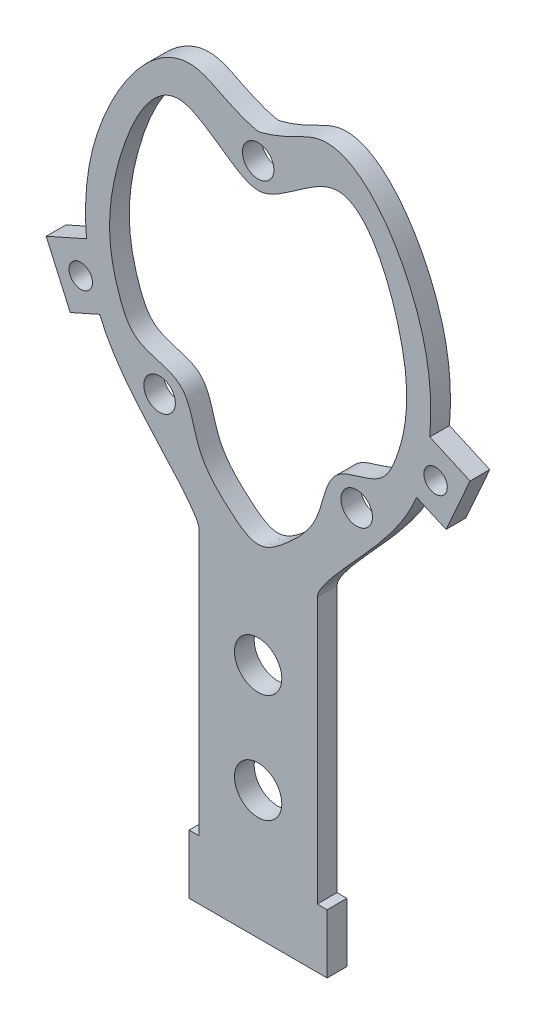
ISO-10303-21;
HEADER;
FILE_DESCRIPTION(('STEP AP214'),'2;1');
FILE_NAME('part.step','',(''),(''),'','','');
FILE_SCHEMA(('AUTOMOTIVE_DESIGN { 1 0 10303 214 1 1 1 1 }'));
ENDSEC;
DATA;
#1=APPLICATION_CONTEXT('core data for automotive mechanical design processes');
#2=APPLICATION_PROTOCOL_DEFINITION('international standard','automotive_design',2000,#1);
#3=PRODUCT_CONTEXT('',#1,'mechanical');
#4=PRODUCT('Part','Part','',(#3));
#5=PRODUCT_RELATED_PRODUCT_CATEGORY('part','',(#4));
#6=PRODUCT_DEFINITION_FORMATION('','',#4);
#7=PRODUCT_DEFINITION_CONTEXT('part definition',#1,'design');
#8=PRODUCT_DEFINITION('design','',#6,#7);
#9=PRODUCT_DEFINITION_SHAPE('','',#8);
#10=(LENGTH_UNIT() NAMED_UNIT(*) SI_UNIT(.MILLI.,.METRE.));
#11=(NAMED_UNIT(*) PLANE_ANGLE_UNIT() SI_UNIT($,.RADIAN.));
#12=(NAMED_UNIT(*) SI_UNIT($,.STERADIAN.) SOLID_ANGLE_UNIT());
#13=UNCERTAINTY_MEASURE_WITH_UNIT(LENGTH_MEASURE(1.E-05),#10,'distance_accuracy_value','');
#14=(GEOMETRIC_REPRESENTATION_CONTEXT(3) GLOBAL_UNCERTAINTY_ASSIGNED_CONTEXT((#13)) GLOBAL_UNIT_ASSIGNED_CONTEXT((#10,
#11,#12)) REPRESENTATION_CONTEXT('',''));
#15=CARTESIAN_POINT('',(0.,0.,0.));
#16=DIRECTION('',(0.,0.,1.));
#17=DIRECTION('',(1.,0.,0.));
#18=AXIS2_PLACEMENT_3D('',#15,#16,#17);
#19=CARTESIAN_POINT('',(3.,-12.1,1.));
#20=CARTESIAN_POINT('',(3.05810382849844,-11.4358702012722,1.));
#21=CARTESIAN_POINT('',(7.37215641866731,-7.261735624356,1.));
#22=CARTESIAN_POINT('',(8.81630154843034,-3.81963664134236,1.));
#23=CARTESIAN_POINT('',(8.79521131462366,3.08822074814355,1.));
#24=CARTESIAN_POINT('',(4.729906030544,9.50271441729499,1.));
#25=CARTESIAN_POINT('',(1.543138013164,7.28524745478808,1.));
#26=CARTESIAN_POINT('',(0.138381746873035,6.84873014882035,1.));
#27=CARTESIAN_POINT('',(-0.138381746873038,6.84873014882035,1.));
#28=CARTESIAN_POINT('',(-1.54313801316398,7.28524745478808,1.));
#29=CARTESIAN_POINT('',(-4.72990603054404,9.50271441729499,1.));
#30=CARTESIAN_POINT('',(-8.79521131462372,3.0882207481436,1.));
#31=CARTESIAN_POINT('',(-8.8163015484302,-3.81963664134249,1.));
#32=CARTESIAN_POINT('',(-7.37215641866838,-7.26173562435472,1.));
#33=CARTESIAN_POINT('',(-3.05810382849843,-11.4358702012722,1.));
#34=CARTESIAN_POINT('',(-3.,-12.1,1.));
#35=B_SPLINE_CURVE_WITH_KNOTS('',3,(#19,#20,#21,#22,#23,#24,#25,#26,#27,#28,#29,#30,#31,#32,#33,
#34),.UNSPECIFIED.,.F.,.F.,(4,1,1,1,1,1,1,1,1,1,1,1,1,4),(0.110531839016768,0.195870509209985,
0.310871914861414,0.375079995003274,0.502014152037678,0.537662277859493,0.553505555343509,
0.55702628367329,0.572869561157307,0.608517686979122,0.735451844013526,0.799659924155386,
0.914661329806814,1.),.UNSPECIFIED.);
#36=DIRECTION('',(0.,0.,-1.));
#37=VECTOR('',#36,1.);
#38=SURFACE_OF_LINEAR_EXTRUSION('',#35,#37);
#39=DIRECTION('',(0.,0.,-1.));
#40=VECTOR('',#39,1.);
#41=CARTESIAN_POINT('',(8.03882350949442,-5.2140110725418,1.));
#42=LINE('',#41,#40);
#43=CARTESIAN_POINT('',(8.03882351508527,-5.2140110590012,1.));
#44=VERTEX_POINT('',#43);
#45=CARTESIAN_POINT('',(8.03882351508527,-5.2140110590012,0.));
#46=VERTEX_POINT('',#45);
#47=EDGE_CURVE('E60',#44,#46,#42,.T.);
#48=ORIENTED_EDGE('',*,*,#47,.F.);
#49=CARTESIAN_POINT('',(3.,-12.1,1.));
#50=VERTEX_POINT('',#49);
#51=EDGE_CURVE('E159',#50,#44,#35,.T.);
#52=ORIENTED_EDGE('',*,*,#51,.F.);
#53=DIRECTION('',(0.,0.,-1.));
#54=VECTOR('',#53,1.);
#55=CARTESIAN_POINT('',(3.,-12.1,1.));
#56=LINE('',#55,#54);
#57=CARTESIAN_POINT('',(3.,-12.1,0.));
#58=VERTEX_POINT('',#57);
#59=EDGE_CURVE('E601',#50,#58,#56,.T.);
#60=ORIENTED_EDGE('',*,*,#59,.T.);
#61=CARTESIAN_POINT('',(3.,-12.1,0.));
#62=CARTESIAN_POINT('',(3.05810382849844,-11.4358702012722,0.));
#63=CARTESIAN_POINT('',(7.37215641866731,-7.261735624356,0.));
#64=CARTESIAN_POINT('',(8.81630154843034,-3.81963664134236,0.));
#65=CARTESIAN_POINT('',(8.79521131462366,3.08822074814355,0.));
#66=CARTESIAN_POINT('',(4.729906030544,9.50271441729499,0.));
#67=CARTESIAN_POINT('',(1.543138013164,7.28524745478808,0.));
#68=CARTESIAN_POINT('',(0.138381746873035,6.84873014882035,0.));
#69=CARTESIAN_POINT('',(-0.138381746873038,6.84873014882035,0.));
#70=CARTESIAN_POINT('',(-1.54313801316398,7.28524745478808,0.));
#71=CARTESIAN_POINT('',(-4.72990603054404,9.50271441729499,0.));
#72=CARTESIAN_POINT('',(-8.79521131462372,3.0882207481436,0.));
#73=CARTESIAN_POINT('',(-8.8163015484302,-3.81963664134249,0.));
#74=CARTESIAN_POINT('',(-7.37215641866838,-7.26173562435472,0.));
#75=CARTESIAN_POINT('',(-3.05810382849843,-11.4358702012722,0.));
#76=CARTESIAN_POINT('',(-3.,-12.1,0.));
#77=B_SPLINE_CURVE_WITH_KNOTS('',3,(#61,#62,#63,#64,#65,#66,#67,#68,#69,#70,#71,#72,#73,#74,#75,
#76),.UNSPECIFIED.,.F.,.F.,(4,1,1,1,1,1,1,1,1,1,1,1,1,4),(0.110531839016768,0.195870509209985,
0.310871914861414,0.375079995003274,0.502014152037678,0.537662277859493,0.553505555343509,
0.55702628367329,0.572869561157307,0.608517686979122,0.735451844013526,0.799659924155386,
0.914661329806814,1.),.UNSPECIFIED.);
#78=EDGE_CURVE('E602',#58,#46,#77,.T.);
#79=ORIENTED_EDGE('',*,*,#78,.T.);
#80=EDGE_LOOP('',(#48,#52,#60,#79));
#81=FACE_BOUND('',#80,.T.);
#82=ADVANCED_FACE('F36',(#81),#38,.F.);
#83=CARTESIAN_POINT('',(8.70653859742456,-2.22738816520244,1.));
#84=VERTEX_POINT('',#83);
#85=CARTESIAN_POINT('',(-8.70653859742455,-2.22738816520243,1.));
#86=VERTEX_POINT('',#85);
#87=EDGE_CURVE('E52',#84,#86,#35,.T.);
#88=ORIENTED_EDGE('',*,*,#87,.F.);
#89=DIRECTION('',(0.,0.,-1.));
#90=VECTOR('',#89,1.);
#91=CARTESIAN_POINT('',(8.70653859884648,-2.22738814841654,1.));
#92=LINE('',#91,#90);
#93=CARTESIAN_POINT('',(8.70653860389698,-2.22738815066517,0.));
#94=VERTEX_POINT('',#93);
#95=EDGE_CURVE('E187',#84,#94,#92,.T.);
#96=ORIENTED_EDGE('',*,*,#95,.T.);
#97=CARTESIAN_POINT('',(-8.70653859742455,-2.22738816520243,0.));
#98=VERTEX_POINT('',#97);
#99=EDGE_CURVE('E566',#94,#98,#77,.T.);
#100=ORIENTED_EDGE('',*,*,#99,.T.);
#101=DIRECTION('',(0.,0.,-1.));
#102=VECTOR('',#101,1.);
#103=CARTESIAN_POINT('',(-8.70653859884646,-2.22738814841654,1.));
#104=LINE('',#103,#102);
#105=EDGE_CURVE('E45',#86,#98,#104,.T.);
#106=ORIENTED_EDGE('',*,*,#105,.F.);
#107=EDGE_LOOP('',(#88,#96,#100,#106));
#108=FACE_BOUND('',#107,.T.);
#109=ADVANCED_FACE('F264',(#108),#38,.F.);
#110=CARTESIAN_POINT('',(4.53553956002682E-13,6.85,1.));
#111=DIRECTION('',(0.,0.,1.));
#112=DIRECTION('',(1.,0.,0.));
#113=AXIS2_PLACEMENT_3D('',#110,#111,#112);
#114=PLANE('',#113);
#115=CARTESIAN_POINT('',(-8.99999999638667,-4.00000000811566,0.999999999999999));
#116=DIRECTION('',(0.,0.,1.));
#117=DIRECTION('',(1.,0.,0.));
#118=AXIS2_PLACEMENT_3D('',#115,#116,#117);
#119=CIRCLE('',#118,0.59499999891735);
#120=CARTESIAN_POINT('',(-8.40499999746932,-4.00000000811566,0.999999999999999));
#121=VERTEX_POINT('',#120);
#122=EDGE_CURVE('E182',#121,#121,#119,.F.);
#123=ORIENTED_EDGE('',*,*,#122,.T.);
#124=EDGE_LOOP('',(#123));
#125=FACE_BOUND('',#124,.T.);
#126=CARTESIAN_POINT('',(8.99999999638667,-4.00000000811566,0.999999999999999));
#127=DIRECTION('',(0.,0.,1.));
#128=DIRECTION('',(1.,0.,0.));
#129=AXIS2_PLACEMENT_3D('',#126,#127,#128);
#130=CIRCLE('',#129,0.594999998917349);
#131=CARTESIAN_POINT('',(9.59499999530402,-4.00000000811566,0.999999999999999));
#132=VERTEX_POINT('',#131);
#133=EDGE_CURVE('E553',#132,#132,#130,.F.);
#134=ORIENTED_EDGE('',*,*,#133,.T.);
#135=EDGE_LOOP('',(#134));
#136=FACE_BOUND('',#135,.T.);
#137=ORIENTED_EDGE('',*,*,#51,.T.);
#138=DIRECTION('',(0.9135454576426,-0.406736643075802,0.));
#139=VECTOR('',#138,1.);
#140=CARTESIAN_POINT('',(-0.607482344183345,-1.36442768453332,1.));
#141=LINE('',#140,#139);
#142=CARTESIAN_POINT('',(9.53182685743955,-5.87873899030865,1.));
#143=VERTEX_POINT('',#142);
#144=EDGE_CURVE('E152',#44,#143,#141,.T.);
#145=ORIENTED_EDGE('',*,*,#144,.T.);
#146=DIRECTION('',(-0.406736643075801,-0.913545457642601,0.));
#147=VECTOR('',#146,1.);
#148=CARTESIAN_POINT('',(10.1393092016229,-4.51431130577532,1.));
#149=LINE('',#148,#147);
#150=CARTESIAN_POINT('',(10.752036786667,-3.13810261738085,1.));
#151=VERTEX_POINT('',#150);
#152=EDGE_CURVE('E158',#151,#143,#149,.T.);
#153=ORIENTED_EDGE('',*,*,#152,.F.);
#154=DIRECTION('',(0.913545457642601,-0.406736643075801,0.));
#155=VECTOR('',#154,1.);
#156=CARTESIAN_POINT('',(0.612727585044053,1.37620868839447,1.));
#157=LINE('',#156,#155);
#158=EDGE_CURVE('E161',#84,#151,#157,.T.);
#159=ORIENTED_EDGE('',*,*,#158,.F.);
#160=ORIENTED_EDGE('',*,*,#87,.T.);
#161=DIRECTION('',(-0.913545457642601,-0.406736643075801,0.));
#162=VECTOR('',#161,1.);
#163=CARTESIAN_POINT('',(-0.612727585044054,1.37620868839447,1.));
#164=LINE('',#163,#162);
#165=CARTESIAN_POINT('',(-10.752036786667,-3.13810261738085,1.));
#166=VERTEX_POINT('',#165);
#167=EDGE_CURVE('E192',#86,#166,#164,.T.);
#168=ORIENTED_EDGE('',*,*,#167,.T.);
#169=DIRECTION('',(0.406736643075801,-0.913545457642601,0.));
#170=VECTOR('',#169,1.);
#171=CARTESIAN_POINT('',(-10.1393092016229,-4.51431130577532,1.));
#172=LINE('',#171,#170);
#173=CARTESIAN_POINT('',(-9.53182685743955,-5.87873899030865,1.));
#174=VERTEX_POINT('',#173);
#175=EDGE_CURVE('E195',#166,#174,#172,.T.);
#176=ORIENTED_EDGE('',*,*,#175,.T.);
#177=DIRECTION('',(-0.9135454576426,-0.406736643075802,0.));
#178=VECTOR('',#177,1.);
#179=CARTESIAN_POINT('',(0.607482344183347,-1.36442768453333,1.));
#180=LINE('',#179,#178);
#181=CARTESIAN_POINT('',(-8.03882351508523,-5.21401105900164,1.));
#182=VERTEX_POINT('',#181);
#183=EDGE_CURVE('E190',#182,#174,#180,.T.);
#184=ORIENTED_EDGE('',*,*,#183,.F.);
#185=CARTESIAN_POINT('',(-3.,-12.1,1.));
#186=VERTEX_POINT('',#185);
#187=EDGE_CURVE('E564',#182,#186,#35,.T.);
#188=ORIENTED_EDGE('',*,*,#187,.T.);
#189=DIRECTION('',(0.,-1.,0.));
#190=VECTOR('',#189,1.);
#191=CARTESIAN_POINT('',(-3.,-12.1,1.));
#192=LINE('',#191,#190);
#193=CARTESIAN_POINT('',(-3.,-25.6,1.));
#194=VERTEX_POINT('',#193);
#195=EDGE_CURVE('E586',#186,#194,#192,.T.);
#196=ORIENTED_EDGE('',*,*,#195,.T.);
#197=DIRECTION('',(-1.,0.,0.));
#198=VECTOR('',#197,1.);
#199=CARTESIAN_POINT('',(-3.,-25.6,1.));
#200=LINE('',#199,#198);
#201=CARTESIAN_POINT('',(-3.50000000000003,-25.6,1.));
#202=VERTEX_POINT('',#201);
#203=EDGE_CURVE('E587',#194,#202,#200,.T.);
#204=ORIENTED_EDGE('',*,*,#203,.T.);
#205=DIRECTION('',(0.,-1.,0.));
#206=VECTOR('',#205,1.);
#207=CARTESIAN_POINT('',(-3.50000000000003,-25.6,1.));
#208=LINE('',#207,#206);
#209=CARTESIAN_POINT('',(-3.49999999999999,-28.6,1.));
#210=VERTEX_POINT('',#209);
#211=EDGE_CURVE('E589',#202,#210,#208,.T.);
#212=ORIENTED_EDGE('',*,*,#211,.T.);
#213=DIRECTION('',(1.,0.,0.));
#214=VECTOR('',#213,1.);
#215=CARTESIAN_POINT('',(-3.49999999999999,-28.6,1.));
#216=LINE('',#215,#214);
#217=CARTESIAN_POINT('',(3.50000000000001,-28.6,1.));
#218=VERTEX_POINT('',#217);
#219=EDGE_CURVE('E593',#210,#218,#216,.T.);
#220=ORIENTED_EDGE('',*,*,#219,.T.);
#221=DIRECTION('',(0.,1.,0.));
#222=VECTOR('',#221,1.);
#223=CARTESIAN_POINT('',(3.50000000000001,-25.6,1.));
#224=LINE('',#223,#222);
#225=CARTESIAN_POINT('',(3.50000000000001,-25.6,1.));
#226=VERTEX_POINT('',#225);
#227=EDGE_CURVE('E595',#218,#226,#224,.T.);
#228=ORIENTED_EDGE('',*,*,#227,.T.);
#229=DIRECTION('',(-1.,0.,0.));
#230=VECTOR('',#229,1.);
#231=CARTESIAN_POINT('',(3.50000000000001,-25.6,1.));
#232=LINE('',#231,#230);
#233=CARTESIAN_POINT('',(3.,-25.6,1.));
#234=VERTEX_POINT('',#233);
#235=EDGE_CURVE('E597',#226,#234,#232,.T.);
#236=ORIENTED_EDGE('',*,*,#235,.T.);
#237=DIRECTION('',(0.,1.,0.));
#238=VECTOR('',#237,1.);
#239=CARTESIAN_POINT('',(3.,-12.1,1.));
#240=LINE('',#239,#238);
#241=EDGE_CURVE('E599',#234,#50,#240,.T.);
#242=ORIENTED_EDGE('',*,*,#241,.T.);
#243=EDGE_LOOP('',(#137,#145,#153,#159,#160,#168,#176,#184,#188,#196,#204,#212,#220,#228,#236,#242));
#244=FACE_BOUND('',#243,.T.);
#245=CARTESIAN_POINT('',(0.,-16.6,1.));
#246=DIRECTION('',(0.,0.,1.));
#247=DIRECTION('',(1.,0.,0.));
#248=AXIS2_PLACEMENT_3D('',#245,#246,#247);
#249=CIRCLE('',#248,1.2);
#250=CARTESIAN_POINT('',(1.2,-16.6,1.));
#251=VERTEX_POINT('',#250);
#252=EDGE_CURVE('E216',#251,#251,#249,.T.);
#253=ORIENTED_EDGE('',*,*,#252,.F.);
#254=EDGE_LOOP('',(#253));
#255=FACE_BOUND('',#254,.T.);
#256=CARTESIAN_POINT('',(-5.,-7.2,1.));
#257=DIRECTION('',(0.,0.,1.));
#258=DIRECTION('',(1.,0.,0.));
#259=AXIS2_PLACEMENT_3D('',#256,#257,#258);
#260=CIRCLE('',#259,0.8);
#261=CARTESIAN_POINT('',(-4.2,-7.2,1.));
#262=VERTEX_POINT('',#261);
#263=EDGE_CURVE('E228',#262,#262,#260,.T.);
#264=ORIENTED_EDGE('',*,*,#263,.F.);
#265=EDGE_LOOP('',(#264));
#266=FACE_BOUND('',#265,.T.);
#267=CARTESIAN_POINT('',(0.,4.25,1.));
#268=CARTESIAN_POINT('',(-0.417612959241417,4.25,1.));
#269=CARTESIAN_POINT('',(-1.80690934296593,5.01629001903986,1.));
#270=CARTESIAN_POINT('',(-4.90120456094953,7.75406004665749,1.));
#271=CARTESIAN_POINT('',(-7.77102892828171,1.12814854184186,1.));
#272=CARTESIAN_POINT('',(-7.63128250838788,-2.66139211837862,1.));
#273=CARTESIAN_POINT('',(-6.25678998999508,-5.75795043264524,1.));
#274=CARTESIAN_POINT('',(-3.50148126295744,-5.76089978012249,1.));
#275=CARTESIAN_POINT('',(-3.23010948222929,-8.78442848255788,1.));
#276=CARTESIAN_POINT('',(-1.74530404014567,-10.3140203641093,1.));
#277=CARTESIAN_POINT('',(0.,-11.6773888370486,1.));
#278=CARTESIAN_POINT('',(1.74530404014568,-10.3140203641093,1.));
#279=CARTESIAN_POINT('',(3.23010948222929,-8.78442848255788,1.));
#280=CARTESIAN_POINT('',(3.50148126295744,-5.76089978012249,1.));
#281=CARTESIAN_POINT('',(6.25678998999508,-5.75795043264524,1.));
#282=CARTESIAN_POINT('',(7.63128250838789,-2.66139211837861,1.));
#283=CARTESIAN_POINT('',(7.77102892828171,1.12814854184186,1.));
#284=CARTESIAN_POINT('',(4.90120456094953,7.75406004665749,1.));
#285=CARTESIAN_POINT('',(1.80690934296593,5.01629001903987,1.));
#286=CARTESIAN_POINT('',(0.417612959241416,4.25,1.));
#287=CARTESIAN_POINT('',(0.,4.25,1.));
#288=B_SPLINE_CURVE_WITH_KNOTS('',3,(#267,#268,#269,#270,#271,#272,#273,#274,#275,#276,#277,
#278,#279,#280,#281,#282,#283,#284,#285,#286,#287),.UNSPECIFIED.,.T.,.F.,(4,1,1,1,1,1,1,1,1,1,1,
1,1,1,1,1,1,1,4),(0.,0.0256073609969135,0.0851894397491001,0.194127412314609,0.29881024186166,
0.326537395156787,0.373370364280356,0.421073962555122,0.469790648406979,0.5,0.530209351593021,
0.578926037444877,0.626629635719644,0.673462604843213,0.70118975813834,0.805872587685391,
0.9148105602509,0.974392639003086,1.),.UNSPECIFIED.);
#289=CARTESIAN_POINT('',(0.,4.25,1.));
#290=VERTEX_POINT('',#289);
#291=EDGE_CURVE('E240',#290,#290,#288,.T.);
#292=ORIENTED_EDGE('',*,*,#291,.F.);
#293=EDGE_LOOP('',(#292));
#294=FACE_BOUND('',#293,.T.);
#295=CARTESIAN_POINT('',(0.,5.55,1.));
#296=DIRECTION('',(0.,0.,1.));
#297=DIRECTION('',(1.,0.,0.));
#298=AXIS2_PLACEMENT_3D('',#295,#296,#297);
#299=CIRCLE('',#298,0.8);
#300=CARTESIAN_POINT('',(0.8,5.55,1.));
#301=VERTEX_POINT('',#300);
#302=EDGE_CURVE('E234',#301,#301,#299,.T.);
#303=ORIENTED_EDGE('',*,*,#302,.F.);
#304=EDGE_LOOP('',(#303));
#305=FACE_BOUND('',#304,.T.);
#306=CARTESIAN_POINT('',(5.,-7.2,1.));
#307=DIRECTION('',(0.,0.,1.));
#308=DIRECTION('',(-1.,0.,0.));
#309=AXIS2_PLACEMENT_3D('',#306,#307,#308);
#310=CIRCLE('',#309,0.8);
#311=CARTESIAN_POINT('',(4.2,-7.2,1.));
#312=VERTEX_POINT('',#311);
#313=EDGE_CURVE('E222',#312,#312,#310,.T.);
#314=ORIENTED_EDGE('',*,*,#313,.F.);
#315=EDGE_LOOP('',(#314));
#316=FACE_BOUND('',#315,.T.);
#317=CARTESIAN_POINT('',(0.,-22.1,1.));
#318=DIRECTION('',(0.,0.,1.));
#319=DIRECTION('',(1.,0.,0.));
#320=AXIS2_PLACEMENT_3D('',#317,#318,#319);
#321=CIRCLE('',#320,1.2);
#322=CARTESIAN_POINT('',(1.2,-22.1,1.));
#323=VERTEX_POINT('',#322);
#324=EDGE_CURVE('E210',#323,#323,#321,.T.);
#325=ORIENTED_EDGE('',*,*,#324,.F.);
#326=EDGE_LOOP('',(#325));
#327=FACE_BOUND('',#326,.T.);
#328=ADVANCED_FACE('F154',(#125,#136,#244,#255,#266,#294,#305,#316,#327),#114,.T.);
#329=CARTESIAN_POINT('',(4.53553956002682E-13,6.85,0.));
#330=DIRECTION('',(0.,0.,1.));
#331=DIRECTION('',(1.,0.,0.));
#332=AXIS2_PLACEMENT_3D('',#329,#330,#331);
#333=PLANE('',#332);
#334=CARTESIAN_POINT('',(-8.99999999638667,-4.00000000811566,0.));
#335=DIRECTION('',(0.,0.,1.));
#336=DIRECTION('',(1.,0.,0.));
#337=AXIS2_PLACEMENT_3D('',#334,#335,#336);
#338=CIRCLE('',#337,0.59499999891735);
#339=CARTESIAN_POINT('',(-8.40499999746932,-4.00000000811566,0.));
#340=VERTEX_POINT('',#339);
#341=EDGE_CURVE('E552',#340,#340,#338,.T.);
#342=ORIENTED_EDGE('',*,*,#341,.T.);
#343=EDGE_LOOP('',(#342));
#344=FACE_BOUND('',#343,.T.);
#345=CARTESIAN_POINT('',(8.99999999638667,-4.00000000811566,0.));
#346=DIRECTION('',(0.,0.,1.));
#347=DIRECTION('',(-1.,0.,0.));
#348=AXIS2_PLACEMENT_3D('',#345,#346,#347);
#349=CIRCLE('',#348,0.594999998917349);
#350=CARTESIAN_POINT('',(8.40499999746932,-4.00000000811566,0.));
#351=VERTEX_POINT('',#350);
#352=EDGE_CURVE('E554',#351,#351,#349,.T.);
#353=ORIENTED_EDGE('',*,*,#352,.T.);
#354=EDGE_LOOP('',(#353));
#355=FACE_BOUND('',#354,.T.);
#356=ORIENTED_EDGE('',*,*,#99,.F.);
#357=DIRECTION('',(0.913545457642601,-0.406736643075801,0.));
#358=VECTOR('',#357,1.);
#359=CARTESIAN_POINT('',(0.612727585044053,1.37620868839447,0.));
#360=LINE('',#359,#358);
#361=CARTESIAN_POINT('',(10.752036786667,-3.13810261738085,0.));
#362=VERTEX_POINT('',#361);
#363=EDGE_CURVE('E180',#94,#362,#360,.T.);
#364=ORIENTED_EDGE('',*,*,#363,.T.);
#365=DIRECTION('',(-0.406736643075801,-0.913545457642601,0.));
#366=VECTOR('',#365,1.);
#367=CARTESIAN_POINT('',(10.1393092016229,-4.51431130577532,0.));
#368=LINE('',#367,#366);
#369=CARTESIAN_POINT('',(9.53182685743955,-5.87873899030865,0.));
#370=VERTEX_POINT('',#369);
#371=EDGE_CURVE('E184',#362,#370,#368,.T.);
#372=ORIENTED_EDGE('',*,*,#371,.T.);
#373=DIRECTION('',(0.9135454576426,-0.406736643075802,0.));
#374=VECTOR('',#373,1.);
#375=CARTESIAN_POINT('',(-0.607482344183345,-1.36442768453332,0.));
#376=LINE('',#375,#374);
#377=EDGE_CURVE('E167',#46,#370,#376,.T.);
#378=ORIENTED_EDGE('',*,*,#377,.F.);
#379=ORIENTED_EDGE('',*,*,#78,.F.);
#380=DIRECTION('',(0.,1.,0.));
#381=VECTOR('',#380,1.);
#382=CARTESIAN_POINT('',(3.,-12.1,0.));
#383=LINE('',#382,#381);
#384=CARTESIAN_POINT('',(3.,-25.6,0.));
#385=VERTEX_POINT('',#384);
#386=EDGE_CURVE('E579',#385,#58,#383,.T.);
#387=ORIENTED_EDGE('',*,*,#386,.F.);
#388=DIRECTION('',(-1.,0.,0.));
#389=VECTOR('',#388,1.);
#390=CARTESIAN_POINT('',(3.50000000000001,-25.6,0.));
#391=LINE('',#390,#389);
#392=CARTESIAN_POINT('',(3.50000000000001,-25.6,0.));
#393=VERTEX_POINT('',#392);
#394=EDGE_CURVE('E580',#393,#385,#391,.T.);
#395=ORIENTED_EDGE('',*,*,#394,.F.);
#396=DIRECTION('',(0.,1.,0.));
#397=VECTOR('',#396,1.);
#398=CARTESIAN_POINT('',(3.50000000000001,-25.6,0.));
#399=LINE('',#398,#397);
#400=CARTESIAN_POINT('',(3.50000000000001,-28.6,0.));
#401=VERTEX_POINT('',#400);
#402=EDGE_CURVE('E617',#401,#393,#399,.T.);
#403=ORIENTED_EDGE('',*,*,#402,.F.);
#404=DIRECTION('',(1.,0.,0.));
#405=VECTOR('',#404,1.);
#406=CARTESIAN_POINT('',(-3.49999999999999,-28.6,0.));
#407=LINE('',#406,#405);
#408=CARTESIAN_POINT('',(-3.49999999999999,-28.6,0.));
#409=VERTEX_POINT('',#408);
#410=EDGE_CURVE('E615',#409,#401,#407,.T.);
#411=ORIENTED_EDGE('',*,*,#410,.F.);
#412=DIRECTION('',(0.,-1.,0.));
#413=VECTOR('',#412,1.);
#414=CARTESIAN_POINT('',(-3.50000000000003,-25.6,0.));
#415=LINE('',#414,#413);
#416=CARTESIAN_POINT('',(-3.50000000000003,-25.6,0.));
#417=VERTEX_POINT('',#416);
#418=EDGE_CURVE('E613',#417,#409,#415,.T.);
#419=ORIENTED_EDGE('',*,*,#418,.F.);
#420=DIRECTION('',(-1.,0.,0.));
#421=VECTOR('',#420,1.);
#422=CARTESIAN_POINT('',(-3.,-25.6,0.));
#423=LINE('',#422,#421);
#424=CARTESIAN_POINT('',(-3.,-25.6,0.));
#425=VERTEX_POINT('',#424);
#426=EDGE_CURVE('E611',#425,#417,#423,.T.);
#427=ORIENTED_EDGE('',*,*,#426,.F.);
#428=DIRECTION('',(0.,-1.,0.));
#429=VECTOR('',#428,1.);
#430=CARTESIAN_POINT('',(-3.,-12.1,0.));
#431=LINE('',#430,#429);
#432=CARTESIAN_POINT('',(-3.,-12.1,0.));
#433=VERTEX_POINT('',#432);
#434=EDGE_CURVE('E606',#433,#425,#431,.T.);
#435=ORIENTED_EDGE('',*,*,#434,.F.);
#436=CARTESIAN_POINT('',(-8.03882350912916,-5.21401107237918,0.));
#437=VERTEX_POINT('',#436);
#438=EDGE_CURVE('E246',#437,#433,#77,.T.);
#439=ORIENTED_EDGE('',*,*,#438,.F.);
#440=DIRECTION('',(-0.9135454576426,-0.406736643075802,0.));
#441=VECTOR('',#440,1.);
#442=CARTESIAN_POINT('',(0.607482344183347,-1.36442768453333,0.));
#443=LINE('',#442,#441);
#444=CARTESIAN_POINT('',(-9.53182685743955,-5.87873899030865,0.));
#445=VERTEX_POINT('',#444);
#446=EDGE_CURVE('E189',#437,#445,#443,.T.);
#447=ORIENTED_EDGE('',*,*,#446,.T.);
#448=DIRECTION('',(0.406736643075801,-0.913545457642601,0.));
#449=VECTOR('',#448,1.);
#450=CARTESIAN_POINT('',(-10.1393092016229,-4.51431130577532,0.));
#451=LINE('',#450,#449);
#452=CARTESIAN_POINT('',(-10.752036786667,-3.13810261738085,0.));
#453=VERTEX_POINT('',#452);
#454=EDGE_CURVE('E193',#453,#445,#451,.T.);
#455=ORIENTED_EDGE('',*,*,#454,.F.);
#456=DIRECTION('',(-0.913545457642601,-0.406736643075801,0.));
#457=VECTOR('',#456,1.);
#458=CARTESIAN_POINT('',(-0.612727585044054,1.37620868839447,0.));
#459=LINE('',#458,#457);
#460=EDGE_CURVE('E200',#98,#453,#459,.T.);
#461=ORIENTED_EDGE('',*,*,#460,.F.);
#462=EDGE_LOOP('',(#356,#364,#372,#378,#379,#387,#395,#403,#411,#419,#427,#435,#439,#447,#455,#461));
#463=FACE_BOUND('',#462,.T.);
#464=CARTESIAN_POINT('',(0.,4.25,0.));
#465=CARTESIAN_POINT('',(-0.417612959241417,4.25,0.));
#466=CARTESIAN_POINT('',(-1.80690934296593,5.01629001903986,0.));
#467=CARTESIAN_POINT('',(-4.90120456094953,7.75406004665749,0.));
#468=CARTESIAN_POINT('',(-7.77102892828171,1.12814854184186,0.));
#469=CARTESIAN_POINT('',(-7.63128250838788,-2.66139211837862,0.));
#470=CARTESIAN_POINT('',(-6.25678998999508,-5.75795043264524,0.));
#471=CARTESIAN_POINT('',(-3.50148126295744,-5.76089978012249,0.));
#472=CARTESIAN_POINT('',(-3.23010948222929,-8.78442848255788,0.));
#473=CARTESIAN_POINT('',(-1.74530404014567,-10.3140203641093,0.));
#474=CARTESIAN_POINT('',(0.,-11.6773888370486,0.));
#475=CARTESIAN_POINT('',(1.74530404014568,-10.3140203641093,0.));
#476=CARTESIAN_POINT('',(3.23010948222929,-8.78442848255788,0.));
#477=CARTESIAN_POINT('',(3.50148126295744,-5.76089978012249,0.));
#478=CARTESIAN_POINT('',(6.25678998999508,-5.75795043264524,0.));
#479=CARTESIAN_POINT('',(7.63128250838789,-2.66139211837861,0.));
#480=CARTESIAN_POINT('',(7.77102892828171,1.12814854184186,0.));
#481=CARTESIAN_POINT('',(4.90120456094953,7.75406004665749,0.));
#482=CARTESIAN_POINT('',(1.80690934296593,5.01629001903987,0.));
#483=CARTESIAN_POINT('',(0.417612959241416,4.25,0.));
#484=CARTESIAN_POINT('',(0.,4.25,0.));
#485=B_SPLINE_CURVE_WITH_KNOTS('',3,(#464,#465,#466,#467,#468,#469,#470,#471,#472,#473,#474,
#475,#476,#477,#478,#479,#480,#481,#482,#483,#484),.UNSPECIFIED.,.T.,.F.,(4,1,1,1,1,1,1,1,1,1,1,
1,1,1,1,1,1,1,4),(0.,0.0256073609969135,0.0851894397491001,0.194127412314609,0.29881024186166,
0.326537395156787,0.373370364280356,0.421073962555122,0.469790648406979,0.5,0.530209351593021,
0.578926037444877,0.626629635719644,0.673462604843213,0.70118975813834,0.805872587685391,
0.9148105602509,0.974392639003086,1.),.UNSPECIFIED.);
#486=CARTESIAN_POINT('',(0.,4.25,0.));
#487=VERTEX_POINT('',#486);
#488=EDGE_CURVE('E237',#487,#487,#485,.T.);
#489=ORIENTED_EDGE('',*,*,#488,.T.);
#490=EDGE_LOOP('',(#489));
#491=FACE_BOUND('',#490,.T.);
#492=CARTESIAN_POINT('',(0.,5.55,0.));
#493=DIRECTION('',(0.,0.,1.));
#494=DIRECTION('',(1.,0.,0.));
#495=AXIS2_PLACEMENT_3D('',#492,#493,#494);
#496=CIRCLE('',#495,0.8);
#497=CARTESIAN_POINT('',(0.8,5.55,0.));
#498=VERTEX_POINT('',#497);
#499=EDGE_CURVE('E231',#498,#498,#496,.T.);
#500=ORIENTED_EDGE('',*,*,#499,.T.);
#501=EDGE_LOOP('',(#500));
#502=FACE_BOUND('',#501,.T.);
#503=CARTESIAN_POINT('',(-5.,-7.2,0.));
#504=DIRECTION('',(0.,0.,1.));
#505=DIRECTION('',(1.,0.,0.));
#506=AXIS2_PLACEMENT_3D('',#503,#504,#505);
#507=CIRCLE('',#506,0.8);
#508=CARTESIAN_POINT('',(-4.2,-7.2,0.));
#509=VERTEX_POINT('',#508);
#510=EDGE_CURVE('E225',#509,#509,#507,.T.);
#511=ORIENTED_EDGE('',*,*,#510,.T.);
#512=EDGE_LOOP('',(#511));
#513=FACE_BOUND('',#512,.T.);
#514=CARTESIAN_POINT('',(5.,-7.2,0.));
#515=DIRECTION('',(0.,0.,1.));
#516=DIRECTION('',(-1.,0.,0.));
#517=AXIS2_PLACEMENT_3D('',#514,#515,#516);
#518=CIRCLE('',#517,0.8);
#519=CARTESIAN_POINT('',(4.2,-7.2,0.));
#520=VERTEX_POINT('',#519);
#521=EDGE_CURVE('E219',#520,#520,#518,.T.);
#522=ORIENTED_EDGE('',*,*,#521,.T.);
#523=EDGE_LOOP('',(#522));
#524=FACE_BOUND('',#523,.T.);
#525=CARTESIAN_POINT('',(0.,-16.6,0.));
#526=DIRECTION('',(0.,0.,1.));
#527=DIRECTION('',(1.,0.,0.));
#528=AXIS2_PLACEMENT_3D('',#525,#526,#527);
#529=CIRCLE('',#528,1.2);
#530=CARTESIAN_POINT('',(1.2,-16.6,0.));
#531=VERTEX_POINT('',#530);
#532=EDGE_CURVE('E213',#531,#531,#529,.T.);
#533=ORIENTED_EDGE('',*,*,#532,.T.);
#534=EDGE_LOOP('',(#533));
#535=FACE_BOUND('',#534,.T.);
#536=CARTESIAN_POINT('',(0.,-22.1,0.));
#537=DIRECTION('',(0.,0.,1.));
#538=DIRECTION('',(1.,0.,0.));
#539=AXIS2_PLACEMENT_3D('',#536,#537,#538);
#540=CIRCLE('',#539,1.2);
#541=CARTESIAN_POINT('',(1.2,-22.1,0.));
#542=VERTEX_POINT('',#541);
#543=EDGE_CURVE('E209',#542,#542,#540,.T.);
#544=ORIENTED_EDGE('',*,*,#543,.T.);
#545=EDGE_LOOP('',(#544));
#546=FACE_BOUND('',#545,.T.);
#547=ADVANCED_FACE('F263',(#344,#355,#463,#491,#502,#513,#524,#535,#546),#333,.F.);
#548=ORIENTED_EDGE('',*,*,#187,.F.);
#549=DIRECTION('',(0.,0.,-1.));
#550=VECTOR('',#549,1.);
#551=CARTESIAN_POINT('',(-8.03882350949455,-5.21401107254185,1.));
#552=LINE('',#551,#550);
#553=EDGE_CURVE('E11',#182,#437,#552,.T.);
#554=ORIENTED_EDGE('',*,*,#553,.T.);
#555=ORIENTED_EDGE('',*,*,#438,.T.);
#556=DIRECTION('',(0.,0.,-1.));
#557=VECTOR('',#556,1.);
#558=CARTESIAN_POINT('',(-3.,-12.1,1.));
#559=LINE('',#558,#557);
#560=EDGE_CURVE('E568',#186,#433,#559,.T.);
#561=ORIENTED_EDGE('',*,*,#560,.F.);
#562=EDGE_LOOP('',(#548,#554,#555,#561));
#563=FACE_BOUND('',#562,.T.);
#564=ADVANCED_FACE('F38',(#563),#38,.F.);
#565=CARTESIAN_POINT('',(-3.,-12.1,1.));
#566=DIRECTION('',(1.,0.,0.));
#567=DIRECTION('',(0.,1.,0.));
#568=AXIS2_PLACEMENT_3D('',#565,#566,#567);
#569=PLANE('',#568);
#570=ORIENTED_EDGE('',*,*,#434,.T.);
#571=DIRECTION('',(0.,0.,-1.));
#572=VECTOR('',#571,1.);
#573=CARTESIAN_POINT('',(-3.,-25.6,1.));
#574=LINE('',#573,#572);
#575=EDGE_CURVE('E637',#194,#425,#574,.T.);
#576=ORIENTED_EDGE('',*,*,#575,.F.);
#577=ORIENTED_EDGE('',*,*,#195,.F.);
#578=ORIENTED_EDGE('',*,*,#560,.T.);
#579=EDGE_LOOP('',(#570,#576,#577,#578));
#580=FACE_BOUND('',#579,.T.);
#581=ADVANCED_FACE('F290',(#580),#569,.F.);
#582=CARTESIAN_POINT('',(-3.,-25.6,1.));
#583=DIRECTION('',(0.,-1.,0.));
#584=DIRECTION('',(0.,0.,-1.));
#585=AXIS2_PLACEMENT_3D('',#582,#583,#584);
#586=PLANE('',#585);
#587=ORIENTED_EDGE('',*,*,#426,.T.);
#588=DIRECTION('',(0.,0.,-1.));
#589=VECTOR('',#588,1.);
#590=CARTESIAN_POINT('',(-3.50000000000003,-25.6,1.));
#591=LINE('',#590,#589);
#592=EDGE_CURVE('E634',#202,#417,#591,.T.);
#593=ORIENTED_EDGE('',*,*,#592,.F.);
#594=ORIENTED_EDGE('',*,*,#203,.F.);
#595=ORIENTED_EDGE('',*,*,#575,.T.);
#596=EDGE_LOOP('',(#587,#593,#594,#595));
#597=FACE_BOUND('',#596,.T.);
#598=ADVANCED_FACE('F287',(#597),#586,.F.);
#599=CARTESIAN_POINT('',(-3.50000000000003,-25.6,1.));
#600=DIRECTION('',(1.,0.,0.));
#601=DIRECTION('',(0.,1.,0.));
#602=AXIS2_PLACEMENT_3D('',#599,#600,#601);
#603=PLANE('',#602);
#604=ORIENTED_EDGE('',*,*,#418,.T.);
#605=DIRECTION('',(0.,0.,-1.));
#606=VECTOR('',#605,1.);
#607=CARTESIAN_POINT('',(-3.49999999999999,-28.6,1.));
#608=LINE('',#607,#606);
#609=EDGE_CURVE('E631',#210,#409,#608,.T.);
#610=ORIENTED_EDGE('',*,*,#609,.F.);
#611=ORIENTED_EDGE('',*,*,#211,.F.);
#612=ORIENTED_EDGE('',*,*,#592,.T.);
#613=EDGE_LOOP('',(#604,#610,#611,#612));
#614=FACE_BOUND('',#613,.T.);
#615=ADVANCED_FACE('F283',(#614),#603,.F.);
#616=CARTESIAN_POINT('',(-3.49999999999999,-28.6,1.));
#617=DIRECTION('',(0.,1.,0.));
#618=DIRECTION('',(0.,0.,1.));
#619=AXIS2_PLACEMENT_3D('',#616,#617,#618);
#620=PLANE('',#619);
#621=ORIENTED_EDGE('',*,*,#410,.T.);
#622=DIRECTION('',(0.,0.,-1.));
#623=VECTOR('',#622,1.);
#624=CARTESIAN_POINT('',(3.50000000000001,-28.6,1.));
#625=LINE('',#624,#623);
#626=EDGE_CURVE('E628',#218,#401,#625,.T.);
#627=ORIENTED_EDGE('',*,*,#626,.F.);
#628=ORIENTED_EDGE('',*,*,#219,.F.);
#629=ORIENTED_EDGE('',*,*,#609,.T.);
#630=EDGE_LOOP('',(#621,#627,#628,#629));
#631=FACE_BOUND('',#630,.T.);
#632=ADVANCED_FACE('F279',(#631),#620,.F.);
#633=CARTESIAN_POINT('',(3.50000000000001,-25.6,1.));
#634=DIRECTION('',(-1.,0.,0.));
#635=DIRECTION('',(0.,-1.,0.));
#636=AXIS2_PLACEMENT_3D('',#633,#634,#635);
#637=PLANE('',#636);
#638=ORIENTED_EDGE('',*,*,#402,.T.);
#639=DIRECTION('',(0.,0.,-1.));
#640=VECTOR('',#639,1.);
#641=CARTESIAN_POINT('',(3.50000000000001,-25.6,1.));
#642=LINE('',#641,#640);
#643=EDGE_CURVE('E625',#226,#393,#642,.T.);
#644=ORIENTED_EDGE('',*,*,#643,.F.);
#645=ORIENTED_EDGE('',*,*,#227,.F.);
#646=ORIENTED_EDGE('',*,*,#626,.T.);
#647=EDGE_LOOP('',(#638,#644,#645,#646));
#648=FACE_BOUND('',#647,.T.);
#649=ADVANCED_FACE('F275',(#648),#637,.F.);
#650=CARTESIAN_POINT('',(3.50000000000001,-25.6,1.));
#651=DIRECTION('',(0.,-1.,0.));
#652=DIRECTION('',(0.,0.,-1.));
#653=AXIS2_PLACEMENT_3D('',#650,#651,#652);
#654=PLANE('',#653);
#655=ORIENTED_EDGE('',*,*,#394,.T.);
#656=DIRECTION('',(0.,0.,-1.));
#657=VECTOR('',#656,1.);
#658=CARTESIAN_POINT('',(3.,-25.6,1.));
#659=LINE('',#658,#657);
#660=EDGE_CURVE('E622',#234,#385,#659,.T.);
#661=ORIENTED_EDGE('',*,*,#660,.F.);
#662=ORIENTED_EDGE('',*,*,#235,.F.);
#663=ORIENTED_EDGE('',*,*,#643,.T.);
#664=EDGE_LOOP('',(#655,#661,#662,#663));
#665=FACE_BOUND('',#664,.T.);
#666=ADVANCED_FACE('F271',(#665),#654,.F.);
#667=CARTESIAN_POINT('',(3.,-12.1,1.));
#668=DIRECTION('',(-1.,0.,0.));
#669=DIRECTION('',(0.,-1.,0.));
#670=AXIS2_PLACEMENT_3D('',#667,#668,#669);
#671=PLANE('',#670);
#672=ORIENTED_EDGE('',*,*,#386,.T.);
#673=ORIENTED_EDGE('',*,*,#59,.F.);
#674=ORIENTED_EDGE('',*,*,#241,.F.);
#675=ORIENTED_EDGE('',*,*,#660,.T.);
#676=EDGE_LOOP('',(#672,#673,#674,#675));
#677=FACE_BOUND('',#676,.T.);
#678=ADVANCED_FACE('F258',(#677),#671,.F.);
#679=DIRECTION('',(0.,0.,-1.));
#680=VECTOR('',#679,1.);
#681=SURFACE_OF_LINEAR_EXTRUSION('',#288,#680);
#682=ORIENTED_EDGE('',*,*,#291,.T.);
#683=EDGE_LOOP('',(#682));
#684=FACE_BOUND('',#683,.T.);
#685=ORIENTED_EDGE('',*,*,#488,.F.);
#686=EDGE_LOOP('',(#685));
#687=FACE_BOUND('',#686,.T.);
#688=ADVANCED_FACE('F253',(#684,#687),#681,.T.);
#689=CARTESIAN_POINT('',(0.,5.55,1.));
#690=DIRECTION('',(0.,0.,-1.));
#691=DIRECTION('',(-1.,0.,0.));
#692=AXIS2_PLACEMENT_3D('',#689,#690,#691);
#693=CYLINDRICAL_SURFACE('',#692,0.8);
#694=ORIENTED_EDGE('',*,*,#302,.T.);
#695=EDGE_LOOP('',(#694));
#696=FACE_BOUND('',#695,.T.);
#697=ORIENTED_EDGE('',*,*,#499,.F.);
#698=EDGE_LOOP('',(#697));
#699=FACE_BOUND('',#698,.T.);
#700=ADVANCED_FACE('F257',(#696,#699),#693,.F.);
#701=CARTESIAN_POINT('',(-5.,-7.2,1.));
#702=DIRECTION('',(0.,0.,-1.));
#703=DIRECTION('',(-1.,0.,0.));
#704=AXIS2_PLACEMENT_3D('',#701,#702,#703);
#705=CYLINDRICAL_SURFACE('',#704,0.8);
#706=ORIENTED_EDGE('',*,*,#263,.T.);
#707=EDGE_LOOP('',(#706));
#708=FACE_BOUND('',#707,.T.);
#709=ORIENTED_EDGE('',*,*,#510,.F.);
#710=EDGE_LOOP('',(#709));
#711=FACE_BOUND('',#710,.T.);
#712=ADVANCED_FACE('F415',(#708,#711),#705,.F.);
#713=CARTESIAN_POINT('',(5.,-7.2,1.));
#714=DIRECTION('',(0.,0.,-1.));
#715=DIRECTION('',(-1.,0.,0.));
#716=AXIS2_PLACEMENT_3D('',#713,#714,#715);
#717=CYLINDRICAL_SURFACE('',#716,0.8);
#718=ORIENTED_EDGE('',*,*,#313,.T.);
#719=EDGE_LOOP('',(#718));
#720=FACE_BOUND('',#719,.T.);
#721=ORIENTED_EDGE('',*,*,#521,.F.);
#722=EDGE_LOOP('',(#721));
#723=FACE_BOUND('',#722,.T.);
#724=ADVANCED_FACE('F412',(#720,#723),#717,.F.);
#725=CARTESIAN_POINT('',(0.,-16.6,1.));
#726=DIRECTION('',(0.,0.,-1.));
#727=DIRECTION('',(-1.,0.,0.));
#728=AXIS2_PLACEMENT_3D('',#725,#726,#727);
#729=CYLINDRICAL_SURFACE('',#728,1.2);
#730=ORIENTED_EDGE('',*,*,#252,.T.);
#731=EDGE_LOOP('',(#730));
#732=FACE_BOUND('',#731,.T.);
#733=ORIENTED_EDGE('',*,*,#532,.F.);
#734=EDGE_LOOP('',(#733));
#735=FACE_BOUND('',#734,.T.);
#736=ADVANCED_FACE('F408',(#732,#735),#729,.F.);
#737=CARTESIAN_POINT('',(0.,-22.1,1.));
#738=DIRECTION('',(0.,0.,-1.));
#739=DIRECTION('',(-1.,0.,0.));
#740=AXIS2_PLACEMENT_3D('',#737,#738,#739);
#741=CYLINDRICAL_SURFACE('',#740,1.2);
#742=ORIENTED_EDGE('',*,*,#324,.T.);
#743=EDGE_LOOP('',(#742));
#744=FACE_BOUND('',#743,.T.);
#745=ORIENTED_EDGE('',*,*,#543,.F.);
#746=EDGE_LOOP('',(#745));
#747=FACE_BOUND('',#746,.T.);
#748=ADVANCED_FACE('F331',(#744,#747),#741,.F.);
#749=CARTESIAN_POINT('',(0.607482344183347,-1.36442768453333,1.));
#750=DIRECTION('',(0.406736643075802,-0.9135454576426,0.));
#751=DIRECTION('',(0.9135454576426,0.406736643075802,0.));
#752=AXIS2_PLACEMENT_3D('',#749,#750,#751);
#753=PLANE('',#752);
#754=ORIENTED_EDGE('',*,*,#553,.F.);
#755=ORIENTED_EDGE('',*,*,#183,.T.);
#756=DIRECTION('',(0.,0.,-1.));
#757=VECTOR('',#756,1.);
#758=CARTESIAN_POINT('',(-9.53182685743955,-5.87873899030865,1.));
#759=LINE('',#758,#757);
#760=EDGE_CURVE('E198',#174,#445,#759,.T.);
#761=ORIENTED_EDGE('',*,*,#760,.T.);
#762=ORIENTED_EDGE('',*,*,#446,.F.);
#763=EDGE_LOOP('',(#754,#755,#761,#762));
#764=FACE_BOUND('',#763,.T.);
#765=ADVANCED_FACE('F325',(#764),#753,.T.);
#766=CARTESIAN_POINT('',(-0.612727585044054,1.37620868839447,1.));
#767=DIRECTION('',(0.406736643075801,-0.913545457642601,0.));
#768=DIRECTION('',(0.913545457642601,0.406736643075801,0.));
#769=AXIS2_PLACEMENT_3D('',#766,#767,#768);
#770=PLANE('',#769);
#771=ORIENTED_EDGE('',*,*,#167,.F.);
#772=ORIENTED_EDGE('',*,*,#105,.T.);
#773=ORIENTED_EDGE('',*,*,#460,.T.);
#774=DIRECTION('',(0.,0.,-1.));
#775=VECTOR('',#774,1.);
#776=CARTESIAN_POINT('',(-10.752036786667,-3.13810261738085,1.));
#777=LINE('',#776,#775);
#778=EDGE_CURVE('E206',#166,#453,#777,.T.);
#779=ORIENTED_EDGE('',*,*,#778,.F.);
#780=EDGE_LOOP('',(#771,#772,#773,#779));
#781=FACE_BOUND('',#780,.T.);
#782=ADVANCED_FACE('F330',(#781),#770,.F.);
#783=CARTESIAN_POINT('',(-10.1393092016229,-4.51431130577532,1.));
#784=DIRECTION('',(0.913545457642601,0.406736643075801,0.));
#785=DIRECTION('',(-0.406736643075801,0.913545457642601,0.));
#786=AXIS2_PLACEMENT_3D('',#783,#784,#785);
#787=PLANE('',#786);
#788=ORIENTED_EDGE('',*,*,#454,.T.);
#789=ORIENTED_EDGE('',*,*,#760,.F.);
#790=ORIENTED_EDGE('',*,*,#175,.F.);
#791=ORIENTED_EDGE('',*,*,#778,.T.);
#792=EDGE_LOOP('',(#788,#789,#790,#791));
#793=FACE_BOUND('',#792,.T.);
#794=ADVANCED_FACE('F344',(#793),#787,.F.);
#795=CARTESIAN_POINT('',(0.612727585044053,1.37620868839447,1.));
#796=DIRECTION('',(0.406736643075801,0.913545457642601,0.));
#797=DIRECTION('',(-0.913545457642601,0.406736643075801,0.));
#798=AXIS2_PLACEMENT_3D('',#795,#796,#797);
#799=PLANE('',#798);
#800=ORIENTED_EDGE('',*,*,#95,.F.);
#801=ORIENTED_EDGE('',*,*,#158,.T.);
#802=DIRECTION('',(0.,0.,-1.));
#803=VECTOR('',#802,1.);
#804=CARTESIAN_POINT('',(10.752036786667,-3.13810261738085,1.));
#805=LINE('',#804,#803);
#806=EDGE_CURVE('E171',#151,#362,#805,.T.);
#807=ORIENTED_EDGE('',*,*,#806,.T.);
#808=ORIENTED_EDGE('',*,*,#363,.F.);
#809=EDGE_LOOP('',(#800,#801,#807,#808));
#810=FACE_BOUND('',#809,.T.);
#811=ADVANCED_FACE('F354',(#810),#799,.T.);
#812=CARTESIAN_POINT('',(-0.607482344183345,-1.36442768453332,1.));
#813=DIRECTION('',(0.406736643075802,0.9135454576426,0.));
#814=DIRECTION('',(-0.9135454576426,0.406736643075802,0.));
#815=AXIS2_PLACEMENT_3D('',#812,#813,#814);
#816=PLANE('',#815);
#817=ORIENTED_EDGE('',*,*,#144,.F.);
#818=ORIENTED_EDGE('',*,*,#47,.T.);
#819=ORIENTED_EDGE('',*,*,#377,.T.);
#820=DIRECTION('',(0.,0.,-1.));
#821=VECTOR('',#820,1.);
#822=CARTESIAN_POINT('',(9.53182685743955,-5.87873899030865,1.));
#823=LINE('',#822,#821);
#824=EDGE_CURVE('E164',#143,#370,#823,.T.);
#825=ORIENTED_EDGE('',*,*,#824,.F.);
#826=EDGE_LOOP('',(#817,#818,#819,#825));
#827=FACE_BOUND('',#826,.T.);
#828=ADVANCED_FACE('F165',(#827),#816,.F.);
#829=CARTESIAN_POINT('',(10.1393092016229,-4.51431130577532,1.));
#830=DIRECTION('',(0.913545457642601,-0.406736643075801,0.));
#831=DIRECTION('',(0.406736643075801,0.913545457642601,0.));
#832=AXIS2_PLACEMENT_3D('',#829,#830,#831);
#833=PLANE('',#832);
#834=ORIENTED_EDGE('',*,*,#371,.F.);
#835=ORIENTED_EDGE('',*,*,#806,.F.);
#836=ORIENTED_EDGE('',*,*,#152,.T.);
#837=ORIENTED_EDGE('',*,*,#824,.T.);
#838=EDGE_LOOP('',(#834,#835,#836,#837));
#839=FACE_BOUND('',#838,.T.);
#840=ADVANCED_FACE('F174',(#839),#833,.T.);
#841=CARTESIAN_POINT('',(8.99999999638667,-4.00000000811566,10.));
#842=DIRECTION('',(0.,0.,-1.));
#843=DIRECTION('',(-1.,0.,0.));
#844=AXIS2_PLACEMENT_3D('',#841,#842,#843);
#845=CYLINDRICAL_SURFACE('',#844,0.594999998917349);
#846=ORIENTED_EDGE('',*,*,#133,.F.);
#847=EDGE_LOOP('',(#846));
#848=FACE_BOUND('',#847,.T.);
#849=ORIENTED_EDGE('',*,*,#352,.F.);
#850=EDGE_LOOP('',(#849));
#851=FACE_BOUND('',#850,.T.);
#852=ADVANCED_FACE('F381',(#848,#851),#845,.F.);
#853=CARTESIAN_POINT('',(-8.99999999638667,-4.00000000811566,10.));
#854=DIRECTION('',(0.,0.,-1.));
#855=DIRECTION('',(-1.,0.,0.));
#856=AXIS2_PLACEMENT_3D('',#853,#854,#855);
#857=CYLINDRICAL_SURFACE('',#856,0.59499999891735);
#858=ORIENTED_EDGE('',*,*,#122,.F.);
#859=EDGE_LOOP('',(#858));
#860=FACE_BOUND('',#859,.T.);
#861=ORIENTED_EDGE('',*,*,#341,.F.);
#862=EDGE_LOOP('',(#861));
#863=FACE_BOUND('',#862,.T.);
#864=ADVANCED_FACE('F390',(#860,#863),#857,.F.);
#865=CLOSED_SHELL('',(#82,#109,#328,#547,#564,#581,#598,#615,#632,#649,#666,#678,#688,#700,#712,
#724,#736,#748,#765,#782,#794,#811,#828,#840,#852,#864));
#866=MANIFOLD_SOLID_BREP('B2',#865);
#867=ADVANCED_BREP_SHAPE_REPRESENTATION('',(#18,#866),#14);
#868=SHAPE_DEFINITION_REPRESENTATION(#9,#867);
ENDSEC;
END-ISO-10303-21;
